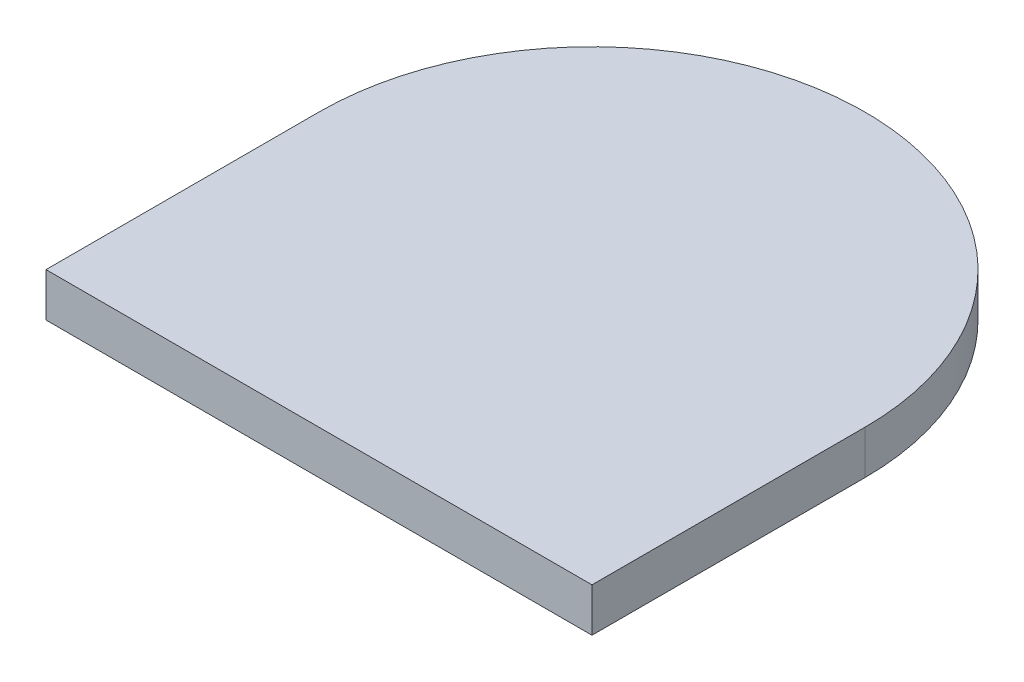
ISO-10303-21;
HEADER;
FILE_DESCRIPTION(('STEP AP214'),'2;1');
FILE_NAME('part.step','',(''),(''),'','','');
FILE_SCHEMA(('AUTOMOTIVE_DESIGN { 1 0 10303 214 1 1 1 1 }'));
ENDSEC;
DATA;
#1=APPLICATION_CONTEXT('core data for automotive mechanical design processes');
#2=APPLICATION_PROTOCOL_DEFINITION('international standard','automotive_design',2000,#1);
#3=PRODUCT_CONTEXT('',#1,'mechanical');
#4=PRODUCT('Part','Part','',(#3));
#5=PRODUCT_RELATED_PRODUCT_CATEGORY('part','',(#4));
#6=PRODUCT_DEFINITION_FORMATION('','',#4);
#7=PRODUCT_DEFINITION_CONTEXT('part definition',#1,'design');
#8=PRODUCT_DEFINITION('design','',#6,#7);
#9=PRODUCT_DEFINITION_SHAPE('','',#8);
#10=(LENGTH_UNIT() NAMED_UNIT(*) SI_UNIT(.MILLI.,.METRE.));
#11=(NAMED_UNIT(*) PLANE_ANGLE_UNIT() SI_UNIT($,.RADIAN.));
#12=(NAMED_UNIT(*) SI_UNIT($,.STERADIAN.) SOLID_ANGLE_UNIT());
#13=UNCERTAINTY_MEASURE_WITH_UNIT(LENGTH_MEASURE(1.E-05),#10,'distance_accuracy_value','');
#14=(GEOMETRIC_REPRESENTATION_CONTEXT(3) GLOBAL_UNCERTAINTY_ASSIGNED_CONTEXT((#13)) GLOBAL_UNIT_ASSIGNED_CONTEXT((#10,
#11,#12)) REPRESENTATION_CONTEXT('',''));
#15=CARTESIAN_POINT('',(0.,0.,0.));
#16=DIRECTION('',(0.,0.,1.));
#17=DIRECTION('',(1.,0.,0.));
#18=AXIS2_PLACEMENT_3D('',#15,#16,#17);
#19=CARTESIAN_POINT('',(25.,-1.,25.));
#20=DIRECTION('',(1.,0.,0.));
#21=DIRECTION('',(0.,0.,-1.));
#22=AXIS2_PLACEMENT_3D('',#19,#20,#21);
#23=PLANE('',#22);
#24=DIRECTION('',(0.,0.,-1.));
#25=VECTOR('',#24,1.);
#26=CARTESIAN_POINT('',(25.,3.,25.));
#27=LINE('',#26,#25);
#28=CARTESIAN_POINT('',(25.,3.,25.));
#29=VERTEX_POINT('',#28);
#30=CARTESIAN_POINT('',(25.,3.,0.));
#31=VERTEX_POINT('',#30);
#32=EDGE_CURVE('E109',#29,#31,#27,.T.);
#33=ORIENTED_EDGE('',*,*,#32,.F.);
#34=DIRECTION('',(0.,1.,0.));
#35=VECTOR('',#34,1.);
#36=CARTESIAN_POINT('',(25.,-1.,25.));
#37=LINE('',#36,#35);
#38=CARTESIAN_POINT('',(25.,-1.,25.));
#39=VERTEX_POINT('',#38);
#40=EDGE_CURVE('E95',#39,#29,#37,.T.);
#41=ORIENTED_EDGE('',*,*,#40,.F.);
#42=DIRECTION('',(0.,0.,-1.));
#43=VECTOR('',#42,1.);
#44=CARTESIAN_POINT('',(25.,-1.,25.));
#45=LINE('',#44,#43);
#46=CARTESIAN_POINT('',(25.,-1.,0.));
#47=VERTEX_POINT('',#46);
#48=EDGE_CURVE('E101',#39,#47,#45,.T.);
#49=ORIENTED_EDGE('',*,*,#48,.T.);
#50=DIRECTION('',(0.,1.,0.));
#51=VECTOR('',#50,1.);
#52=CARTESIAN_POINT('',(25.,-1.,0.));
#53=LINE('',#52,#51);
#54=EDGE_CURVE('E49',#47,#31,#53,.T.);
#55=ORIENTED_EDGE('',*,*,#54,.T.);
#56=EDGE_LOOP('',(#33,#41,#49,#55));
#57=FACE_BOUND('',#56,.T.);
#58=ADVANCED_FACE('F39',(#57),#23,.T.);
#59=CARTESIAN_POINT('',(0.,-1.,25.));
#60=DIRECTION('',(0.,0.,1.));
#61=DIRECTION('',(1.,0.,0.));
#62=AXIS2_PLACEMENT_3D('',#59,#60,#61);
#63=PLANE('',#62);
#64=DIRECTION('',(1.,0.,0.));
#65=VECTOR('',#64,1.);
#66=CARTESIAN_POINT('',(0.,3.,25.));
#67=LINE('',#66,#65);
#68=CARTESIAN_POINT('',(-25.,3.,25.));
#69=VERTEX_POINT('',#68);
#70=EDGE_CURVE('E73',#69,#29,#67,.T.);
#71=ORIENTED_EDGE('',*,*,#70,.F.);
#72=DIRECTION('',(0.,1.,0.));
#73=VECTOR('',#72,1.);
#74=CARTESIAN_POINT('',(-25.,-1.,25.));
#75=LINE('',#74,#73);
#76=CARTESIAN_POINT('',(-25.,-1.,25.));
#77=VERTEX_POINT('',#76);
#78=EDGE_CURVE('E89',#77,#69,#75,.T.);
#79=ORIENTED_EDGE('',*,*,#78,.F.);
#80=DIRECTION('',(1.,0.,0.));
#81=VECTOR('',#80,1.);
#82=CARTESIAN_POINT('',(-25.,-1.,25.));
#83=LINE('',#82,#81);
#84=EDGE_CURVE('E92',#77,#39,#83,.T.);
#85=ORIENTED_EDGE('',*,*,#84,.T.);
#86=ORIENTED_EDGE('',*,*,#40,.T.);
#87=EDGE_LOOP('',(#71,#79,#85,#86));
#88=FACE_BOUND('',#87,.T.);
#89=ADVANCED_FACE('F91',(#88),#63,.T.);
#90=CARTESIAN_POINT('',(-25.,-1.,0.));
#91=DIRECTION('',(-1.,0.,0.));
#92=DIRECTION('',(0.,0.,1.));
#93=AXIS2_PLACEMENT_3D('',#90,#91,#92);
#94=PLANE('',#93);
#95=DIRECTION('',(0.,0.,1.));
#96=VECTOR('',#95,1.);
#97=CARTESIAN_POINT('',(-25.,3.,0.));
#98=LINE('',#97,#96);
#99=CARTESIAN_POINT('',(-25.,3.,0.));
#100=VERTEX_POINT('',#99);
#101=EDGE_CURVE('E114',#100,#69,#98,.T.);
#102=ORIENTED_EDGE('',*,*,#101,.F.);
#103=DIRECTION('',(0.,1.,0.));
#104=VECTOR('',#103,1.);
#105=CARTESIAN_POINT('',(-25.,-1.,0.));
#106=LINE('',#105,#104);
#107=CARTESIAN_POINT('',(-25.,-1.,0.));
#108=VERTEX_POINT('',#107);
#109=EDGE_CURVE('E84',#108,#100,#106,.T.);
#110=ORIENTED_EDGE('',*,*,#109,.F.);
#111=DIRECTION('',(0.,0.,1.));
#112=VECTOR('',#111,1.);
#113=CARTESIAN_POINT('',(-25.,-1.,0.));
#114=LINE('',#113,#112);
#115=EDGE_CURVE('E100',#108,#77,#114,.T.);
#116=ORIENTED_EDGE('',*,*,#115,.T.);
#117=ORIENTED_EDGE('',*,*,#78,.T.);
#118=EDGE_LOOP('',(#102,#110,#116,#117));
#119=FACE_BOUND('',#118,.T.);
#120=ADVANCED_FACE('F104',(#119),#94,.T.);
#121=CARTESIAN_POINT('',(0.,-1.,0.));
#122=DIRECTION('',(0.,1.,0.));
#123=DIRECTION('',(0.,0.,1.));
#124=AXIS2_PLACEMENT_3D('',#121,#122,#123);
#125=PLANE('',#124);
#126=CARTESIAN_POINT('',(0.,-1.,0.));
#127=DIRECTION('',(0.,1.,0.));
#128=DIRECTION('',(0.,0.,1.));
#129=AXIS2_PLACEMENT_3D('',#126,#127,#128);
#130=CIRCLE('',#129,25.);
#131=EDGE_CURVE('E106',#47,#108,#130,.T.);
#132=ORIENTED_EDGE('',*,*,#131,.F.);
#133=ORIENTED_EDGE('',*,*,#48,.F.);
#134=ORIENTED_EDGE('',*,*,#84,.F.);
#135=ORIENTED_EDGE('',*,*,#115,.F.);
#136=EDGE_LOOP('',(#132,#133,#134,#135));
#137=FACE_BOUND('',#136,.T.);
#138=ADVANCED_FACE('F99',(#137),#125,.F.);
#139=CARTESIAN_POINT('',(0.,3.,0.));
#140=DIRECTION('',(0.,-1.,0.));
#141=DIRECTION('',(0.,0.,-1.));
#142=AXIS2_PLACEMENT_3D('',#139,#140,#141);
#143=CYLINDRICAL_SURFACE('',#142,25.);
#144=CARTESIAN_POINT('',(0.,3.,0.));
#145=DIRECTION('',(0.,1.,0.));
#146=DIRECTION('',(0.,0.,1.));
#147=AXIS2_PLACEMENT_3D('',#144,#145,#146);
#148=CIRCLE('',#147,25.);
#149=EDGE_CURVE('E11',#31,#100,#148,.T.);
#150=ORIENTED_EDGE('',*,*,#149,.F.);
#151=ORIENTED_EDGE('',*,*,#54,.F.);
#152=ORIENTED_EDGE('',*,*,#131,.T.);
#153=ORIENTED_EDGE('',*,*,#109,.T.);
#154=EDGE_LOOP('',(#150,#151,#152,#153));
#155=FACE_BOUND('',#154,.T.);
#156=ADVANCED_FACE('F41',(#155),#143,.T.);
#157=CARTESIAN_POINT('',(0.,3.,0.));
#158=DIRECTION('',(0.,1.,0.));
#159=DIRECTION('',(0.,0.,1.));
#160=AXIS2_PLACEMENT_3D('',#157,#158,#159);
#161=PLANE('',#160);
#162=ORIENTED_EDGE('',*,*,#101,.T.);
#163=ORIENTED_EDGE('',*,*,#70,.T.);
#164=ORIENTED_EDGE('',*,*,#32,.T.);
#165=ORIENTED_EDGE('',*,*,#149,.T.);
#166=EDGE_LOOP('',(#162,#163,#164,#165));
#167=FACE_BOUND('',#166,.T.);
#168=ADVANCED_FACE('F125',(#167),#161,.T.);
#169=CLOSED_SHELL('',(#58,#89,#120,#138,#156,#168));
#170=MANIFOLD_SOLID_BREP('B2',#169);
#171=ADVANCED_BREP_SHAPE_REPRESENTATION('',(#18,#170),#14);
#172=SHAPE_DEFINITION_REPRESENTATION(#9,#171);
ENDSEC;
END-ISO-10303-21;
